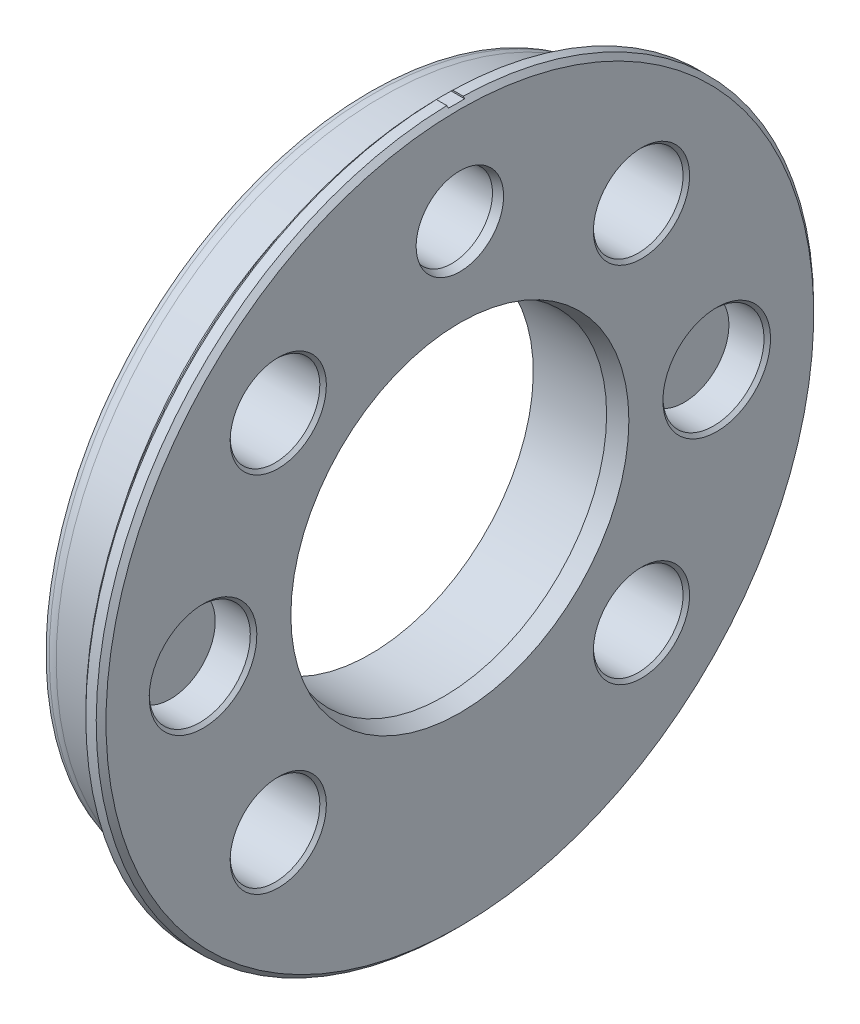
ISO-10303-21;
HEADER;
FILE_DESCRIPTION(('STEP AP214'),'2;1');
FILE_NAME('part.step','',(''),(''),'','','');
FILE_SCHEMA(('AUTOMOTIVE_DESIGN { 1 0 10303 214 1 1 1 1 }'));
ENDSEC;
DATA;
#1=APPLICATION_CONTEXT('core data for automotive mechanical design processes');
#2=APPLICATION_PROTOCOL_DEFINITION('international standard','automotive_design',2000,#1);
#3=PRODUCT_CONTEXT('',#1,'mechanical');
#4=PRODUCT('Part','Part','',(#3));
#5=PRODUCT_RELATED_PRODUCT_CATEGORY('part','',(#4));
#6=PRODUCT_DEFINITION_FORMATION('','',#4);
#7=PRODUCT_DEFINITION_CONTEXT('part definition',#1,'design');
#8=PRODUCT_DEFINITION('design','',#6,#7);
#9=PRODUCT_DEFINITION_SHAPE('','',#8);
#10=(LENGTH_UNIT() NAMED_UNIT(*) SI_UNIT(.MILLI.,.METRE.));
#11=(NAMED_UNIT(*) PLANE_ANGLE_UNIT() SI_UNIT($,.RADIAN.));
#12=(NAMED_UNIT(*) SI_UNIT($,.STERADIAN.) SOLID_ANGLE_UNIT());
#13=UNCERTAINTY_MEASURE_WITH_UNIT(LENGTH_MEASURE(1.E-05),#10,'distance_accuracy_value','');
#14=(GEOMETRIC_REPRESENTATION_CONTEXT(3) GLOBAL_UNCERTAINTY_ASSIGNED_CONTEXT((#13)) GLOBAL_UNIT_ASSIGNED_CONTEXT((#10,
#11,#12)) REPRESENTATION_CONTEXT('',''));
#15=CARTESIAN_POINT('',(0.,0.,0.));
#16=DIRECTION('',(0.,0.,1.));
#17=DIRECTION('',(1.,0.,0.));
#18=AXIS2_PLACEMENT_3D('',#15,#16,#17);
#19=CARTESIAN_POINT('',(436.499877841862,791.1,0.00364851934697978));
#20=DIRECTION('',(-1.,0.,0.));
#21=DIRECTION('',(0.,1.,0.));
#22=AXIS2_PLACEMENT_3D('',#19,#20,#21);
#23=PLANE('',#22);
#24=CARTESIAN_POINT('',(436.499877841862,791.1,0.00364851934695719));
#25=DIRECTION('',(1.,0.,0.));
#26=DIRECTION('',(0.,1.,0.));
#27=AXIS2_PLACEMENT_3D('',#24,#25,#26);
#28=CIRCLE('',#27,10.);
#29=CARTESIAN_POINT('',(436.499877841862,801.1,0.0036485193469578));
#30=VERTEX_POINT('',#29);
#31=EDGE_CURVE('E251',#30,#30,#28,.T.);
#32=ORIENTED_EDGE('',*,*,#31,.T.);
#33=EDGE_LOOP('',(#32));
#34=FACE_BOUND('',#33,.T.);
#35=CARTESIAN_POINT('',(436.499877841862,806.85,0.00364851934695426));
#36=DIRECTION('',(1.,0.,0.));
#37=DIRECTION('',(0.,1.,0.));
#38=AXIS2_PLACEMENT_3D('',#35,#36,#37);
#39=CIRCLE('',#38,2.49999999999994);
#40=CARTESIAN_POINT('',(436.499877841862,809.35,0.00364851934695441));
#41=VERTEX_POINT('',#40);
#42=EDGE_CURVE('E246',#41,#41,#39,.T.);
#43=ORIENTED_EDGE('',*,*,#42,.T.);
#44=EDGE_LOOP('',(#43));
#45=FACE_BOUND('',#44,.T.);
#46=CARTESIAN_POINT('',(436.499877841862,802.236931803686,-11.1332832843411));
#47=DIRECTION('',(1.,0.,0.));
#48=DIRECTION('',(0.,1.,0.));
#49=AXIS2_PLACEMENT_3D('',#46,#47,#48);
#50=CIRCLE('',#49,2.75);
#51=CARTESIAN_POINT('',(436.499877841862,799.486931803686,-11.1332832843411));
#52=VERTEX_POINT('',#51);
#53=EDGE_CURVE('E242',#52,#52,#50,.T.);
#54=ORIENTED_EDGE('',*,*,#53,.T.);
#55=EDGE_LOOP('',(#54));
#56=FACE_BOUND('',#55,.T.);
#57=CARTESIAN_POINT('',(436.499877841862,802.236931803685,11.1405803230352));
#58=DIRECTION('',(1.,0.,0.));
#59=DIRECTION('',(0.,1.,0.));
#60=AXIS2_PLACEMENT_3D('',#57,#58,#59);
#61=CIRCLE('',#60,2.75);
#62=CARTESIAN_POINT('',(436.499877841862,799.486931803685,11.1405803230352));
#63=VERTEX_POINT('',#62);
#64=EDGE_CURVE('E240',#63,#63,#61,.T.);
#65=ORIENTED_EDGE('',*,*,#64,.T.);
#66=EDGE_LOOP('',(#65));
#67=FACE_BOUND('',#66,.T.);
#68=CARTESIAN_POINT('',(436.499877841862,779.963068196309,11.140580323035));
#69=DIRECTION('',(1.,0.,0.));
#70=DIRECTION('',(0.,1.,0.));
#71=AXIS2_PLACEMENT_3D('',#68,#69,#70);
#72=CIRCLE('',#71,2.75);
#73=CARTESIAN_POINT('',(436.499877841862,777.213068196309,11.140580323035));
#74=VERTEX_POINT('',#73);
#75=EDGE_CURVE('E243',#74,#74,#72,.T.);
#76=ORIENTED_EDGE('',*,*,#75,.T.);
#77=EDGE_LOOP('',(#76));
#78=FACE_BOUND('',#77,.T.);
#79=CARTESIAN_POINT('',(436.499877841862,779.96306819631,-11.1332832843413));
#80=DIRECTION('',(1.,0.,0.));
#81=DIRECTION('',(0.,1.,0.));
#82=AXIS2_PLACEMENT_3D('',#79,#80,#81);
#83=CIRCLE('',#82,2.75);
#84=CARTESIAN_POINT('',(436.499877841862,777.213068196309,-11.1332832843413));
#85=VERTEX_POINT('',#84);
#86=EDGE_CURVE('E269',#85,#85,#83,.T.);
#87=ORIENTED_EDGE('',*,*,#86,.T.);
#88=EDGE_LOOP('',(#87));
#89=FACE_BOUND('',#88,.T.);
#90=CARTESIAN_POINT('',(436.499877841862,791.1,0.00364851934695723));
#91=DIRECTION('',(1.,0.,0.));
#92=DIRECTION('',(0.,1.,0.));
#93=AXIS2_PLACEMENT_3D('',#90,#91,#92);
#94=CIRCLE('',#93,19.875);
#95=CARTESIAN_POINT('',(436.499877841862,810.975,0.003648519346956));
#96=VERTEX_POINT('',#95);
#97=EDGE_CURVE('E48',#96,#96,#94,.T.);
#98=ORIENTED_EDGE('',*,*,#97,.F.);
#99=EDGE_LOOP('',(#98));
#100=FACE_BOUND('',#99,.T.);
#101=ADVANCED_FACE('F24',(#34,#45,#56,#67,#78,#89,#100),#23,.T.);
#102=CARTESIAN_POINT('',(439.999877841862,791.1,-15.746351480653));
#103=DIRECTION('',(1.,0.,0.));
#104=DIRECTION('',(0.,0.,1.));
#105=AXIS2_PLACEMENT_3D('',#102,#103,#104);
#106=PLANE('',#105);
#107=CARTESIAN_POINT('',(439.999877841862,791.1,-15.746351480653));
#108=DIRECTION('',(-1.,0.,0.));
#109=DIRECTION('',(0.,0.,-1.));
#110=AXIS2_PLACEMENT_3D('',#107,#108,#109);
#111=CIRCLE('',#110,2.75);
#112=CARTESIAN_POINT('',(439.999877841862,791.1,-18.496351480653));
#113=VERTEX_POINT('',#112);
#114=EDGE_CURVE('E294',#113,#113,#111,.T.);
#115=ORIENTED_EDGE('',*,*,#114,.F.);
#116=EDGE_LOOP('',(#115));
#117=FACE_BOUND('',#116,.T.);
#118=ADVANCED_FACE('F439',(#117),#106,.T.);
#119=CARTESIAN_POINT('',(439.999877841862,791.1,15.753648519347));
#120=DIRECTION('',(1.,0.,0.));
#121=DIRECTION('',(0.,0.,1.));
#122=AXIS2_PLACEMENT_3D('',#119,#120,#121);
#123=PLANE('',#122);
#124=CARTESIAN_POINT('',(439.999877841862,791.1,15.753648519347));
#125=DIRECTION('',(-1.,0.,0.));
#126=DIRECTION('',(0.,0.,-1.));
#127=AXIS2_PLACEMENT_3D('',#124,#125,#126);
#128=CIRCLE('',#127,2.75);
#129=CARTESIAN_POINT('',(439.999877841862,791.1,13.003648519347));
#130=VERTEX_POINT('',#129);
#131=EDGE_CURVE('E266',#130,#130,#128,.T.);
#132=ORIENTED_EDGE('',*,*,#131,.F.);
#133=EDGE_LOOP('',(#132));
#134=FACE_BOUND('',#133,.T.);
#135=ADVANCED_FACE('F445',(#134),#123,.T.);
#136=CARTESIAN_POINT('',(436.999877841862,791.1,-15.7463514806531));
#137=DIRECTION('',(1.,0.,0.));
#138=DIRECTION('',(0.,0.,-1.));
#139=AXIS2_PLACEMENT_3D('',#136,#137,#138);
#140=PLANE('',#139);
#141=CARTESIAN_POINT('',(436.999877841862,791.1,-15.746351480653));
#142=DIRECTION('',(-1.,0.,0.));
#143=DIRECTION('',(0.,0.,-1.));
#144=AXIS2_PLACEMENT_3D('',#141,#142,#143);
#145=CIRCLE('',#144,2.75);
#146=CARTESIAN_POINT('',(436.999877841862,791.1,-18.496351480653));
#147=VERTEX_POINT('',#146);
#148=EDGE_CURVE('E28',#147,#147,#145,.T.);
#149=ORIENTED_EDGE('',*,*,#148,.T.);
#150=EDGE_LOOP('',(#149));
#151=FACE_BOUND('',#150,.T.);
#152=CARTESIAN_POINT('',(436.999877841862,791.1,-15.7463514806531));
#153=DIRECTION('',(1.,0.,0.));
#154=DIRECTION('',(0.,-1.,0.));
#155=AXIS2_PLACEMENT_3D('',#152,#153,#154);
#156=CIRCLE('',#155,3.1);
#157=CARTESIAN_POINT('',(436.999877841862,788.,-15.7463514806531));
#158=VERTEX_POINT('',#157);
#159=EDGE_CURVE('E271',#158,#158,#156,.T.);
#160=ORIENTED_EDGE('',*,*,#159,.T.);
#161=EDGE_LOOP('',(#160));
#162=FACE_BOUND('',#161,.T.);
#163=ADVANCED_FACE('F498',(#151,#162),#140,.T.);
#164=CARTESIAN_POINT('',(436.999877841862,791.1,15.7536485193469));
#165=DIRECTION('',(1.,0.,0.));
#166=DIRECTION('',(0.,0.,-1.));
#167=AXIS2_PLACEMENT_3D('',#164,#165,#166);
#168=PLANE('',#167);
#169=CARTESIAN_POINT('',(436.999877841862,791.1,15.753648519347));
#170=DIRECTION('',(-1.,0.,0.));
#171=DIRECTION('',(0.,0.,-1.));
#172=AXIS2_PLACEMENT_3D('',#169,#170,#171);
#173=CIRCLE('',#172,2.75);
#174=CARTESIAN_POINT('',(436.999877841862,791.1,13.003648519347));
#175=VERTEX_POINT('',#174);
#176=EDGE_CURVE('E189',#175,#175,#173,.T.);
#177=ORIENTED_EDGE('',*,*,#176,.T.);
#178=EDGE_LOOP('',(#177));
#179=FACE_BOUND('',#178,.T.);
#180=CARTESIAN_POINT('',(436.999877841862,791.1,15.7536485193469));
#181=DIRECTION('',(1.,0.,0.));
#182=DIRECTION('',(0.,-1.,0.));
#183=AXIS2_PLACEMENT_3D('',#180,#181,#182);
#184=CIRCLE('',#183,3.1);
#185=CARTESIAN_POINT('',(436.999877841862,788.,15.7536485193469));
#186=VERTEX_POINT('',#185);
#187=EDGE_CURVE('E274',#186,#186,#184,.T.);
#188=ORIENTED_EDGE('',*,*,#187,.T.);
#189=EDGE_LOOP('',(#188));
#190=FACE_BOUND('',#189,.T.);
#191=ADVANCED_FACE('F419',(#179,#190),#168,.T.);
#192=CARTESIAN_POINT('',(433.999877841862,791.1,0.503648519346957));
#193=DIRECTION('',(0.,0.,1.));
#194=DIRECTION('',(-1.,0.,0.));
#195=AXIS2_PLACEMENT_3D('',#192,#193,#194);
#196=PLANE('',#195);
#197=DIRECTION('',(-0.707015048123164,-0.707198502350931,0.));
#198=VECTOR('',#197,1.);
#199=CARTESIAN_POINT('',(441.058885371226,813.09431744792,0.503648519346953));
#200=LINE('',#199,#198);
#201=CARTESIAN_POINT('',(441.058885371226,813.09431744792,0.503648519346961));
#202=VERTEX_POINT('',#201);
#203=CARTESIAN_POINT('',(440.964592390266,813.,0.503648523394978));
#204=VERTEX_POINT('',#203);
#205=EDGE_CURVE('E280',#202,#204,#200,.T.);
#206=ORIENTED_EDGE('',*,*,#205,.F.);
#207=DIRECTION('',(-1.,0.,0.));
#208=VECTOR('',#207,1.);
#209=CARTESIAN_POINT('',(433.999877841862,813.09431744792,0.503648519346965));
#210=LINE('',#209,#208);
#211=CARTESIAN_POINT('',(441.699877841862,813.09431744792,0.503648519346965));
#212=VERTEX_POINT('',#211);
#213=EDGE_CURVE('E13',#212,#202,#210,.T.);
#214=ORIENTED_EDGE('',*,*,#213,.F.);
#215=CARTESIAN_POINT('',(441.794170822913,813.,0.503648519346955));
#216=CARTESIAN_POINT('',(441.76273982923,813.031439114204,0.503651595019211));
#217=CARTESIAN_POINT('',(441.731308835546,813.062878263662,0.503651595021498));
#218=CARTESIAN_POINT('',(441.699877841862,813.09431744792,0.503648519346965));
#219=(BOUNDED_CURVE() B_SPLINE_CURVE(3,(#215,#216,#217,#218),.UNSPECIFIED.,.F.,
.F.) B_SPLINE_CURVE_WITH_KNOTS((4,4),(0.,1.),
.UNSPECIFIED.) CURVE() GEOMETRIC_REPRESENTATION_ITEM() RATIONAL_B_SPLINE_CURVE((1.,1.,1.,1.)) REPRESENTATION_ITEM(''));
#220=CARTESIAN_POINT('',(441.794170822913,813.,0.503648519346955));
#221=VERTEX_POINT('',#220);
#222=EDGE_CURVE('E326',#221,#212,#219,.T.);
#223=ORIENTED_EDGE('',*,*,#222,.F.);
#224=DIRECTION('',(-1.,0.,0.));
#225=VECTOR('',#224,1.);
#226=CARTESIAN_POINT('',(440.058885371226,813.,0.503648519346953));
#227=LINE('',#226,#225);
#228=EDGE_CURVE('E256',#221,#204,#227,.T.);
#229=ORIENTED_EDGE('',*,*,#228,.T.);
#230=EDGE_LOOP('',(#206,#214,#223,#229));
#231=FACE_BOUND('',#230,.T.);
#232=ADVANCED_FACE('F505',(#231),#196,.F.);
#233=CARTESIAN_POINT('',(433.999877841862,791.1,0.00364851934695719));
#234=DIRECTION('',(-1.,0.,0.));
#235=DIRECTION('',(0.,1.,0.));
#236=AXIS2_PLACEMENT_3D('',#233,#234,#235);
#237=CYLINDRICAL_SURFACE('',#236,22.);
#238=DIRECTION('',(-1.,0.,0.));
#239=VECTOR('',#238,1.);
#240=CARTESIAN_POINT('',(433.999877841862,813.09431744792,-0.496351480653047));
#241=LINE('',#240,#239);
#242=CARTESIAN_POINT('',(441.699877841862,813.09431744792,-0.496351480653048));
#243=VERTEX_POINT('',#242);
#244=CARTESIAN_POINT('',(441.058885371226,813.09431744792,-0.496351480653046));
#245=VERTEX_POINT('',#244);
#246=EDGE_CURVE('E35',#243,#245,#241,.T.);
#247=ORIENTED_EDGE('',*,*,#246,.F.);
#248=CARTESIAN_POINT('',(441.699877841862,791.1,0.00364851934695723));
#249=DIRECTION('',(1.,0.,0.));
#250=DIRECTION('',(0.,1.,0.));
#251=AXIS2_PLACEMENT_3D('',#248,#249,#250);
#252=CIRCLE('',#251,22.);
#253=EDGE_CURVE('E350',#212,#243,#252,.T.);
#254=ORIENTED_EDGE('',*,*,#253,.F.);
#255=ORIENTED_EDGE('',*,*,#213,.T.);
#256=CARTESIAN_POINT('',(441.058885371226,791.1,0.00364851934695719));
#257=DIRECTION('',(1.,0.,0.));
#258=DIRECTION('',(0.,1.,0.));
#259=AXIS2_PLACEMENT_3D('',#256,#257,#258);
#260=CIRCLE('',#259,22.);
#261=EDGE_CURVE('E276',#202,#245,#260,.T.);
#262=ORIENTED_EDGE('',*,*,#261,.T.);
#263=EDGE_LOOP('',(#247,#254,#255,#262));
#264=FACE_BOUND('',#263,.T.);
#265=ADVANCED_FACE('F396',(#264),#237,.T.);
#266=CARTESIAN_POINT('',(433.999877841862,791.1,-0.496351480653043));
#267=DIRECTION('',(0.,0.,1.));
#268=DIRECTION('',(-1.,0.,0.));
#269=AXIS2_PLACEMENT_3D('',#266,#267,#268);
#270=PLANE('',#269);
#271=ORIENTED_EDGE('',*,*,#246,.T.);
#272=CARTESIAN_POINT('',(440.964592390174,813.,-0.496351480653047));
#273=CARTESIAN_POINT('',(440.996023383858,813.031439114204,-0.4963545563253));
#274=CARTESIAN_POINT('',(441.027454377541,813.062878263662,-0.496354556327583));
#275=CARTESIAN_POINT('',(441.058885371226,813.09431744792,-0.496351480653046));
#276=(BOUNDED_CURVE() B_SPLINE_CURVE(3,(#272,#273,#274,#275),.UNSPECIFIED.,.F.,
.F.) B_SPLINE_CURVE_WITH_KNOTS((4,4),(0.,1.),
.UNSPECIFIED.) CURVE() GEOMETRIC_REPRESENTATION_ITEM() RATIONAL_B_SPLINE_CURVE((1.,1.,1.,1.)) REPRESENTATION_ITEM(''));
#277=CARTESIAN_POINT('',(440.964592390174,813.,-0.496351480653047));
#278=VERTEX_POINT('',#277);
#279=EDGE_CURVE('E267',#278,#245,#276,.T.);
#280=ORIENTED_EDGE('',*,*,#279,.F.);
#281=DIRECTION('',(1.,0.,0.));
#282=VECTOR('',#281,1.);
#283=CARTESIAN_POINT('',(440.058885371226,813.,-0.496351480653047));
#284=LINE('',#283,#282);
#285=CARTESIAN_POINT('',(441.794170557885,813.000000265094,-0.496351480678981));
#286=VERTEX_POINT('',#285);
#287=EDGE_CURVE('E177',#278,#286,#284,.T.);
#288=ORIENTED_EDGE('',*,*,#287,.T.);
#289=CARTESIAN_POINT('',(441.699877841862,813.09431744792,-0.496351480653048));
#290=CARTESIAN_POINT('',(441.731308747203,813.062878352027,-0.496354556318939));
#291=CARTESIAN_POINT('',(441.762739652545,813.031439290935,-0.4963545563253));
#292=CARTESIAN_POINT('',(441.794170557885,813.000000265094,-0.496351480678981));
#293=(BOUNDED_CURVE() B_SPLINE_CURVE(3,(#289,#290,#291,#292),.UNSPECIFIED.,.F.,
.F.) B_SPLINE_CURVE_WITH_KNOTS((4,4),(0.,0.99999906310439),
.UNSPECIFIED.) CURVE() GEOMETRIC_REPRESENTATION_ITEM() RATIONAL_B_SPLINE_CURVE((1.,1.,1.,1.)) REPRESENTATION_ITEM(''));
#294=EDGE_CURVE('E344',#243,#286,#293,.T.);
#295=ORIENTED_EDGE('',*,*,#294,.F.);
#296=EDGE_LOOP('',(#271,#280,#288,#295));
#297=FACE_BOUND('',#296,.T.);
#298=ADVANCED_FACE('F400',(#297),#270,.T.);
#299=CARTESIAN_POINT('',(440.058885371226,813.,-0.496351480653047));
#300=DIRECTION('',(0.,-1.,0.));
#301=DIRECTION('',(0.,0.,1.));
#302=AXIS2_PLACEMENT_3D('',#299,#300,#301);
#303=PLANE('',#302);
#304=CARTESIAN_POINT('',(440.958885371226,813.,0.00364851934695589));
#305=CARTESIAN_POINT('',(440.958885371226,813.,-0.163025376815659));
#306=CARTESIAN_POINT('',(440.960787710875,813.,-0.329663100609856));
#307=CARTESIAN_POINT('',(440.964592390174,813.,-0.496351480653047));
#308=(BOUNDED_CURVE() B_SPLINE_CURVE(3,(#304,#305,#306,#307),.UNSPECIFIED.,.F.,
.F.) B_SPLINE_CURVE_WITH_KNOTS((4,4),(0.,1.),
.UNSPECIFIED.) CURVE() GEOMETRIC_REPRESENTATION_ITEM() RATIONAL_B_SPLINE_CURVE((1.,1.,1.,1.)) REPRESENTATION_ITEM(''));
#309=CARTESIAN_POINT('',(440.958885371226,813.,0.00364851934695589));
#310=VERTEX_POINT('',#309);
#311=EDGE_CURVE('E379',#310,#278,#308,.T.);
#312=ORIENTED_EDGE('',*,*,#311,.F.);
#313=CARTESIAN_POINT('',(440.964592390266,813.,0.503648523394978));
#314=CARTESIAN_POINT('',(440.960787710936,813.000000000059,0.336960142000939));
#315=CARTESIAN_POINT('',(440.958885371226,813.,0.170322415509467));
#316=CARTESIAN_POINT('',(440.958885371226,813.,0.00364851934695589));
#317=(BOUNDED_CURVE() B_SPLINE_CURVE(3,(#313,#314,#315,#316),.UNSPECIFIED.,.F.,
.F.) B_SPLINE_CURVE_WITH_KNOTS((4,4),(0.,1.),
.UNSPECIFIED.) CURVE() GEOMETRIC_REPRESENTATION_ITEM() RATIONAL_B_SPLINE_CURVE((1.,1.,1.,1.)) REPRESENTATION_ITEM(''));
#318=EDGE_CURVE('E319',#204,#310,#317,.T.);
#319=ORIENTED_EDGE('',*,*,#318,.F.);
#320=ORIENTED_EDGE('',*,*,#228,.F.);
#321=CARTESIAN_POINT('',(441.799877841862,813.,0.00364851934696125));
#322=CARTESIAN_POINT('',(441.799877841862,813.,0.170322415509611));
#323=CARTESIAN_POINT('',(441.797975502212,813.,0.336960139303805));
#324=CARTESIAN_POINT('',(441.794170822913,813.,0.503648519346955));
#325=(BOUNDED_CURVE() B_SPLINE_CURVE(3,(#321,#322,#323,#324),.UNSPECIFIED.,.F.,
.F.) B_SPLINE_CURVE_WITH_KNOTS((4,4),(0.,1.),
.UNSPECIFIED.) CURVE() GEOMETRIC_REPRESENTATION_ITEM() RATIONAL_B_SPLINE_CURVE((1.,1.,1.,1.)) REPRESENTATION_ITEM(''));
#326=CARTESIAN_POINT('',(441.799877841862,813.,0.00364851934696125));
#327=VERTEX_POINT('',#326);
#328=EDGE_CURVE('E320',#327,#221,#325,.T.);
#329=ORIENTED_EDGE('',*,*,#328,.F.);
#330=CARTESIAN_POINT('',(441.794170557885,813.000000265094,-0.496351480678981));
#331=CARTESIAN_POINT('',(441.797975443255,813.,-0.32966568447429));
#332=CARTESIAN_POINT('',(441.799877841862,813.,-0.163027959320533));
#333=CARTESIAN_POINT('',(441.799877841862,813.,0.00364851934696125));
#334=(BOUNDED_CURVE() B_SPLINE_CURVE(3,(#330,#331,#332,#333),.UNSPECIFIED.,.F.,
.F.) B_SPLINE_CURVE_WITH_KNOTS((4,4),(0.,1.),
.UNSPECIFIED.) CURVE() GEOMETRIC_REPRESENTATION_ITEM() RATIONAL_B_SPLINE_CURVE((1.,1.,1.,1.)) REPRESENTATION_ITEM(''));
#335=EDGE_CURVE('E327',#286,#327,#334,.T.);
#336=ORIENTED_EDGE('',*,*,#335,.F.);
#337=ORIENTED_EDGE('',*,*,#287,.F.);
#338=EDGE_LOOP('',(#312,#319,#320,#329,#336,#337));
#339=FACE_BOUND('',#338,.T.);
#340=ADVANCED_FACE('F455',(#339),#303,.F.);
#341=CARTESIAN_POINT('',(441.999877841862,801.1,0.00364851934695533));
#342=DIRECTION('',(-1.,0.,0.));
#343=DIRECTION('',(0.,1.,0.));
#344=AXIS2_PLACEMENT_3D('',#341,#342,#343);
#345=PLANE('',#344);
#346=CARTESIAN_POINT('',(441.999877841862,791.1,0.00364851934695723));
#347=DIRECTION('',(1.,0.,0.));
#348=DIRECTION('',(0.,-1.,0.));
#349=AXIS2_PLACEMENT_3D('',#346,#347,#348);
#350=CIRCLE('',#349,10.3639702342662);
#351=CARTESIAN_POINT('',(441.999877841862,780.736029765731,0.0036485193469566));
#352=VERTEX_POINT('',#351);
#353=EDGE_CURVE('E343',#352,#352,#350,.T.);
#354=ORIENTED_EDGE('',*,*,#353,.F.);
#355=EDGE_LOOP('',(#354));
#356=FACE_BOUND('',#355,.T.);
#357=CARTESIAN_POINT('',(441.999877841926,806.85,0.00364851934695429));
#358=DIRECTION('',(1.,0.,0.));
#359=DIRECTION('',(0.,-1.,0.));
#360=AXIS2_PLACEMENT_3D('',#357,#358,#359);
#361=CIRCLE('',#360,2.68198511713836);
#362=CARTESIAN_POINT('',(441.999877841926,804.168014882859,0.00364851934695412));
#363=VERTEX_POINT('',#362);
#364=EDGE_CURVE('E360',#363,#363,#361,.T.);
#365=ORIENTED_EDGE('',*,*,#364,.F.);
#366=EDGE_LOOP('',(#365));
#367=FACE_BOUND('',#366,.T.);
#368=CARTESIAN_POINT('',(441.999877841901,802.236931803686,-11.1332832843411));
#369=DIRECTION('',(1.,0.,0.));
#370=DIRECTION('',(0.,-1.,0.));
#371=AXIS2_PLACEMENT_3D('',#368,#369,#370);
#372=CIRCLE('',#371,2.94999999999846);
#373=CARTESIAN_POINT('',(441.999877841901,799.286931803687,-11.1332832843411));
#374=VERTEX_POINT('',#373);
#375=EDGE_CURVE('E224',#374,#374,#372,.T.);
#376=ORIENTED_EDGE('',*,*,#375,.F.);
#377=EDGE_LOOP('',(#376));
#378=FACE_BOUND('',#377,.T.);
#379=CARTESIAN_POINT('',(441.999877841787,802.236931803685,11.1405803230352));
#380=DIRECTION('',(1.,0.,0.));
#381=DIRECTION('',(0.,-1.,0.));
#382=AXIS2_PLACEMENT_3D('',#379,#380,#381);
#383=CIRCLE('',#382,2.94999999999846);
#384=CARTESIAN_POINT('',(441.999877841787,799.286931803687,11.1405803230352));
#385=VERTEX_POINT('',#384);
#386=EDGE_CURVE('E225',#385,#385,#383,.T.);
#387=ORIENTED_EDGE('',*,*,#386,.F.);
#388=EDGE_LOOP('',(#387));
#389=FACE_BOUND('',#388,.T.);
#390=CARTESIAN_POINT('',(441.999877841952,779.963068196309,11.140580323035));
#391=DIRECTION('',(1.,0.,0.));
#392=DIRECTION('',(0.,-1.,0.));
#393=AXIS2_PLACEMENT_3D('',#390,#391,#392);
#394=CIRCLE('',#393,2.95000000011214);
#395=CARTESIAN_POINT('',(441.999877841952,777.013068196197,11.140580323035));
#396=VERTEX_POINT('',#395);
#397=EDGE_CURVE('E247',#396,#396,#394,.T.);
#398=ORIENTED_EDGE('',*,*,#397,.F.);
#399=EDGE_LOOP('',(#398));
#400=FACE_BOUND('',#399,.T.);
#401=CARTESIAN_POINT('',(441.999877841782,779.96306819631,-11.1332832843413));
#402=DIRECTION('',(1.,0.,0.));
#403=DIRECTION('',(0.,-1.,0.));
#404=AXIS2_PLACEMENT_3D('',#401,#402,#403);
#405=CIRCLE('',#404,2.94999999999846);
#406=CARTESIAN_POINT('',(441.999877841782,777.013068196311,-11.1332832843413));
#407=VERTEX_POINT('',#406);
#408=EDGE_CURVE('E305',#407,#407,#405,.T.);
#409=ORIENTED_EDGE('',*,*,#408,.F.);
#410=EDGE_LOOP('',(#409));
#411=FACE_BOUND('',#410,.T.);
#412=CARTESIAN_POINT('',(441.999877841813,791.1,-15.7463514806531));
#413=DIRECTION('',(1.,0.,0.));
#414=DIRECTION('',(0.,-1.,0.));
#415=AXIS2_PLACEMENT_3D('',#412,#413,#414);
#416=CIRCLE('',#415,3.29999999991059);
#417=CARTESIAN_POINT('',(441.999877841813,787.800000000087,-15.7463514806531));
#418=VERTEX_POINT('',#417);
#419=EDGE_CURVE('E300',#418,#418,#416,.T.);
#420=ORIENTED_EDGE('',*,*,#419,.F.);
#421=EDGE_LOOP('',(#420));
#422=FACE_BOUND('',#421,.T.);
#423=CARTESIAN_POINT('',(441.999877841756,791.1,15.7536485193469));
#424=DIRECTION('',(1.,0.,0.));
#425=DIRECTION('',(0.,-1.,0.));
#426=AXIS2_PLACEMENT_3D('',#423,#424,#425);
#427=CIRCLE('',#426,3.29999999991059);
#428=CARTESIAN_POINT('',(441.999877841756,787.800000000087,15.7536485193469));
#429=VERTEX_POINT('',#428);
#430=EDGE_CURVE('E301',#429,#429,#427,.T.);
#431=ORIENTED_EDGE('',*,*,#430,.F.);
#432=EDGE_LOOP('',(#431));
#433=FACE_BOUND('',#432,.T.);
#434=CARTESIAN_POINT('',(441.999877841862,791.1,0.00364851934695723));
#435=DIRECTION('',(-1.,0.,0.));
#436=DIRECTION('',(0.,1.,0.));
#437=AXIS2_PLACEMENT_3D('',#434,#435,#436);
#438=CIRCLE('',#437,21.7);
#439=CARTESIAN_POINT('',(441.999877841862,769.4,0.00364851934695323));
#440=VERTEX_POINT('',#439);
#441=EDGE_CURVE('E336',#440,#440,#438,.T.);
#442=ORIENTED_EDGE('',*,*,#441,.F.);
#443=EDGE_LOOP('',(#442));
#444=FACE_BOUND('',#443,.T.);
#445=ADVANCED_FACE('F461',(#356,#367,#378,#389,#400,#411,#422,#433,#444),#345,.F.);
#446=CARTESIAN_POINT('',(436.761017843024,791.1,0.00364851934695723));
#447=DIRECTION('',(1.,0.,0.));
#448=DIRECTION('',(0.,-1.,0.));
#449=AXIS2_PLACEMENT_3D('',#446,#447,#448);
#450=CONICAL_SURFACE('',#449,19.9402850002906,0.244978663126864);
#451=CARTESIAN_POINT('',(436.761017843024,791.1,0.00364851934695723));
#452=DIRECTION('',(-1.,0.,0.));
#453=DIRECTION('',(0.,-1.,0.));
#454=AXIS2_PLACEMENT_3D('',#451,#452,#453);
#455=CIRCLE('',#454,19.9402850002906);
#456=CARTESIAN_POINT('',(436.761017843024,771.159714999707,0.00364851934695601));
#457=VERTEX_POINT('',#456);
#458=EDGE_CURVE('E287',#457,#457,#455,.T.);
#459=ORIENTED_EDGE('',*,*,#458,.T.);
#460=EDGE_LOOP('',(#459));
#461=FACE_BOUND('',#460,.T.);
#462=ORIENTED_EDGE('',*,*,#97,.T.);
#463=EDGE_LOOP('',(#462));
#464=FACE_BOUND('',#463,.T.);
#465=ADVANCED_FACE('F26',(#461,#464),#450,.T.);
#466=CARTESIAN_POINT('',(433.999877841862,791.1,0.00364851934695719));
#467=DIRECTION('',(-1.,0.,0.));
#468=DIRECTION('',(0.,1.,0.));
#469=AXIS2_PLACEMENT_3D('',#466,#467,#468);
#470=CYLINDRICAL_SURFACE('',#469,10.);
#471=ORIENTED_EDGE('',*,*,#31,.F.);
#472=EDGE_LOOP('',(#471));
#473=FACE_BOUND('',#472,.T.);
#474=CARTESIAN_POINT('',(440.999877841862,791.1,0.00364851934695723));
#475=DIRECTION('',(1.,0.,0.));
#476=DIRECTION('',(0.,-1.,0.));
#477=AXIS2_PLACEMENT_3D('',#474,#475,#476);
#478=CIRCLE('',#477,10.);
#479=CARTESIAN_POINT('',(440.999877841862,781.1,0.00364851934695535));
#480=VERTEX_POINT('',#479);
#481=EDGE_CURVE('E337',#480,#480,#478,.T.);
#482=ORIENTED_EDGE('',*,*,#481,.T.);
#483=EDGE_LOOP('',(#482));
#484=FACE_BOUND('',#483,.T.);
#485=ADVANCED_FACE('F456',(#473,#484),#470,.F.);
#486=CARTESIAN_POINT('',(431.711307163006,806.85,0.00364851934695426));
#487=DIRECTION('',(-1.,0.,0.));
#488=DIRECTION('',(0.,1.,0.));
#489=AXIS2_PLACEMENT_3D('',#486,#487,#488);
#490=CYLINDRICAL_SURFACE('',#489,2.49999999999994);
#491=ORIENTED_EDGE('',*,*,#42,.F.);
#492=EDGE_LOOP('',(#491));
#493=FACE_BOUND('',#492,.T.);
#494=CARTESIAN_POINT('',(441.499877841825,806.85,0.00364851934695559));
#495=DIRECTION('',(1.,0.,0.));
#496=DIRECTION('',(0.,-1.,0.));
#497=AXIS2_PLACEMENT_3D('',#494,#495,#496);
#498=CIRCLE('',#497,2.50000000000073);
#499=CARTESIAN_POINT('',(441.499877841825,804.35,0.00364851934695379));
#500=VERTEX_POINT('',#499);
#501=EDGE_CURVE('E232',#500,#500,#498,.T.);
#502=ORIENTED_EDGE('',*,*,#501,.T.);
#503=EDGE_LOOP('',(#502));
#504=FACE_BOUND('',#503,.T.);
#505=ADVANCED_FACE('F459',(#493,#504),#490,.F.);
#506=CARTESIAN_POINT('',(441.999877841862,802.236931803686,-11.1332832843411));
#507=DIRECTION('',(1.,0.,0.));
#508=DIRECTION('',(0.,-1.,0.));
#509=AXIS2_PLACEMENT_3D('',#506,#507,#508);
#510=CYLINDRICAL_SURFACE('',#509,2.75);
#511=CARTESIAN_POINT('',(441.79987784192,802.236931803686,-11.1332832843411));
#512=DIRECTION('',(1.,0.,0.));
#513=DIRECTION('',(0.,-1.,0.));
#514=AXIS2_PLACEMENT_3D('',#511,#512,#513);
#515=CIRCLE('',#514,2.74999999996095);
#516=CARTESIAN_POINT('',(441.79987784192,799.486931803725,-11.1332832843411));
#517=VERTEX_POINT('',#516);
#518=EDGE_CURVE('E219',#517,#517,#515,.T.);
#519=ORIENTED_EDGE('',*,*,#518,.T.);
#520=EDGE_LOOP('',(#519));
#521=FACE_BOUND('',#520,.T.);
#522=ORIENTED_EDGE('',*,*,#53,.F.);
#523=EDGE_LOOP('',(#522));
#524=FACE_BOUND('',#523,.T.);
#525=ADVANCED_FACE('F220',(#521,#524),#510,.F.);
#526=CARTESIAN_POINT('',(441.999877841862,802.236931803685,11.1405803230352));
#527=DIRECTION('',(1.,0.,0.));
#528=DIRECTION('',(0.,-1.,0.));
#529=AXIS2_PLACEMENT_3D('',#526,#527,#528);
#530=CYLINDRICAL_SURFACE('',#529,2.75);
#531=CARTESIAN_POINT('',(441.799877841863,802.236931803685,11.1405803230352));
#532=DIRECTION('',(1.,0.,0.));
#533=DIRECTION('',(0.,-1.,0.));
#534=AXIS2_PLACEMENT_3D('',#531,#532,#533);
#535=CIRCLE('',#534,2.75000000007441);
#536=CARTESIAN_POINT('',(441.799877841863,799.486931803611,11.1405803230352));
#537=VERTEX_POINT('',#536);
#538=EDGE_CURVE('E235',#537,#537,#535,.T.);
#539=ORIENTED_EDGE('',*,*,#538,.T.);
#540=EDGE_LOOP('',(#539));
#541=FACE_BOUND('',#540,.T.);
#542=ORIENTED_EDGE('',*,*,#64,.F.);
#543=EDGE_LOOP('',(#542));
#544=FACE_BOUND('',#543,.T.);
#545=ADVANCED_FACE('F451',(#541,#544),#530,.F.);
#546=CARTESIAN_POINT('',(441.999877841862,779.963068196309,11.140580323035));
#547=DIRECTION('',(1.,0.,0.));
#548=DIRECTION('',(0.,-1.,0.));
#549=AXIS2_PLACEMENT_3D('',#546,#547,#548);
#550=CYLINDRICAL_SURFACE('',#549,2.75);
#551=CARTESIAN_POINT('',(441.799877841863,779.963068196309,11.140580323035));
#552=DIRECTION('',(1.,0.,0.));
#553=DIRECTION('',(0.,-1.,0.));
#554=AXIS2_PLACEMENT_3D('',#551,#552,#553);
#555=CIRCLE('',#554,2.75000000002279);
#556=CARTESIAN_POINT('',(441.799877841863,777.213068196287,11.140580323035));
#557=VERTEX_POINT('',#556);
#558=EDGE_CURVE('E250',#557,#557,#555,.T.);
#559=ORIENTED_EDGE('',*,*,#558,.T.);
#560=EDGE_LOOP('',(#559));
#561=FACE_BOUND('',#560,.T.);
#562=ORIENTED_EDGE('',*,*,#75,.F.);
#563=EDGE_LOOP('',(#562));
#564=FACE_BOUND('',#563,.T.);
#565=ADVANCED_FACE('F491',(#561,#564),#550,.F.);
#566=CARTESIAN_POINT('',(441.999877841862,779.96306819631,-11.1332832843413));
#567=DIRECTION('',(1.,0.,0.));
#568=DIRECTION('',(0.,-1.,0.));
#569=AXIS2_PLACEMENT_3D('',#566,#567,#568);
#570=CYLINDRICAL_SURFACE('',#569,2.75);
#571=CARTESIAN_POINT('',(441.799877841807,779.96306819631,-11.1332832843413));
#572=DIRECTION('',(1.,0.,0.));
#573=DIRECTION('',(0.,-1.,0.));
#574=AXIS2_PLACEMENT_3D('',#571,#572,#573);
#575=CIRCLE('',#574,2.75000000002301);
#576=CARTESIAN_POINT('',(441.799877841807,777.213068196287,-11.1332832843413));
#577=VERTEX_POINT('',#576);
#578=EDGE_CURVE('E309',#577,#577,#575,.T.);
#579=ORIENTED_EDGE('',*,*,#578,.T.);
#580=EDGE_LOOP('',(#579));
#581=FACE_BOUND('',#580,.T.);
#582=ORIENTED_EDGE('',*,*,#86,.F.);
#583=EDGE_LOOP('',(#582));
#584=FACE_BOUND('',#583,.T.);
#585=ADVANCED_FACE('F488',(#581,#584),#570,.F.);
#586=CARTESIAN_POINT('',(439.500806681313,791.1,0.00364851934695723));
#587=DIRECTION('',(-1.,0.,0.));
#588=DIRECTION('',(0.,1.,0.));
#589=AXIS2_PLACEMENT_3D('',#586,#587,#588);
#590=CONICAL_SURFACE('',#589,20.,0.261799387799139);
#591=CARTESIAN_POINT('',(439.500806681313,791.1,0.00364851934695719));
#592=DIRECTION('',(-1.,0.,0.));
#593=DIRECTION('',(0.,1.,0.));
#594=AXIS2_PLACEMENT_3D('',#591,#592,#593);
#595=CIRCLE('',#594,20.);
#596=CARTESIAN_POINT('',(439.500806681313,771.1,0.00364851934695356));
#597=VERTEX_POINT('',#596);
#598=EDGE_CURVE('E286',#597,#597,#595,.T.);
#599=ORIENTED_EDGE('',*,*,#598,.F.);
#600=EDGE_LOOP('',(#599));
#601=FACE_BOUND('',#600,.T.);
#602=CARTESIAN_POINT('',(440.196350223821,791.1,0.00364851934695549));
#603=DIRECTION('',(-1.,0.,0.));
#604=DIRECTION('',(0.,0.,1.));
#605=AXIS2_PLACEMENT_3D('',#602,#603,#604);
#606=CIRCLE('',#605,19.8136296694843);
#607=CARTESIAN_POINT('',(440.196350223821,771.286370330513,0.00364851934695346));
#608=VERTEX_POINT('',#607);
#609=EDGE_CURVE('E263',#608,#608,#606,.T.);
#610=ORIENTED_EDGE('',*,*,#609,.T.);
#611=EDGE_LOOP('',(#610));
#612=FACE_BOUND('',#611,.T.);
#613=ADVANCED_FACE('F474',(#601,#612),#590,.T.);
#614=CARTESIAN_POINT('',(433.999877841862,791.1,0.00364851934695719));
#615=DIRECTION('',(-1.,0.,0.));
#616=DIRECTION('',(0.,1.,0.));
#617=AXIS2_PLACEMENT_3D('',#614,#615,#616);
#618=CYLINDRICAL_SURFACE('',#617,20.);
#619=CARTESIAN_POINT('',(437.246089093097,791.1,0.00364851934695723));
#620=DIRECTION('',(-1.,0.,0.));
#621=DIRECTION('',(0.,0.,1.));
#622=AXIS2_PLACEMENT_3D('',#619,#620,#621);
#623=CIRCLE('',#622,20.);
#624=CARTESIAN_POINT('',(437.246089093097,771.1,0.00364851934695351));
#625=VERTEX_POINT('',#624);
#626=EDGE_CURVE('E283',#625,#625,#623,.T.);
#627=ORIENTED_EDGE('',*,*,#626,.F.);
#628=EDGE_LOOP('',(#627));
#629=FACE_BOUND('',#628,.T.);
#630=ORIENTED_EDGE('',*,*,#598,.T.);
#631=EDGE_LOOP('',(#630));
#632=FACE_BOUND('',#631,.T.);
#633=ADVANCED_FACE('F470',(#629,#632),#618,.T.);
#634=CARTESIAN_POINT('',(437.246089093097,791.1,0.00364851934695549));
#635=DIRECTION('',(1.,0.,0.));
#636=DIRECTION('',(0.,-1.,0.));
#637=AXIS2_PLACEMENT_3D('',#634,#635,#636);
#638=TOROIDAL_SURFACE('',#637,18.0000000000003,1.99999999999968);
#639=ORIENTED_EDGE('',*,*,#626,.T.);
#640=EDGE_LOOP('',(#639));
#641=FACE_BOUND('',#640,.T.);
#642=ORIENTED_EDGE('',*,*,#458,.F.);
#643=EDGE_LOOP('',(#642));
#644=FACE_BOUND('',#643,.T.);
#645=ADVANCED_FACE('F473',(#641,#644),#638,.T.);
#646=CARTESIAN_POINT('',(440.839710011966,791.1,0.00364851934695723));
#647=DIRECTION('',(1.,0.,0.));
#648=DIRECTION('',(0.,-1.,0.));
#649=AXIS2_PLACEMENT_3D('',#646,#647,#648);
#650=CONICAL_SURFACE('',#649,21.7808246407406,1.48352986419519);
#651=CARTESIAN_POINT('',(440.839710011966,791.1,0.00364851934695723));
#652=DIRECTION('',(1.,0.,0.));
#653=DIRECTION('',(0.,-1.,0.));
#654=AXIS2_PLACEMENT_3D('',#651,#652,#653);
#655=CIRCLE('',#654,21.7808246407406);
#656=CARTESIAN_POINT('',(440.839710011966,812.880824640738,0.0036485193469559));
#657=VERTEX_POINT('',#656);
#658=EDGE_CURVE('E273',#657,#657,#655,.T.);
#659=ORIENTED_EDGE('',*,*,#658,.F.);
#660=EDGE_LOOP('',(#659));
#661=FACE_BOUND('',#660,.T.);
#662=CARTESIAN_POINT('',(440.698355721098,791.1,0.00364851934695723));
#663=DIRECTION('',(1.,0.,0.));
#664=DIRECTION('',(0.,-1.,0.));
#665=AXIS2_PLACEMENT_3D('',#662,#663,#664);
#666=CIRCLE('',#665,20.1651377029009);
#667=CARTESIAN_POINT('',(440.698355721098,811.265137702899,0.0036485193469602));
#668=VERTEX_POINT('',#667);
#669=EDGE_CURVE('E259',#668,#668,#666,.T.);
#670=ORIENTED_EDGE('',*,*,#669,.T.);
#671=EDGE_LOOP('',(#670));
#672=FACE_BOUND('',#671,.T.);
#673=ADVANCED_FACE('F486',(#661,#672),#650,.T.);
#674=CARTESIAN_POINT('',(471.749877841862,791.1,-15.746351480653));
#675=DIRECTION('',(1.,0.,0.));
#676=DIRECTION('',(0.,0.,-1.));
#677=AXIS2_PLACEMENT_3D('',#674,#675,#676);
#678=CYLINDRICAL_SURFACE('',#677,2.75);
#679=ORIENTED_EDGE('',*,*,#114,.T.);
#680=EDGE_LOOP('',(#679));
#681=FACE_BOUND('',#680,.T.);
#682=ORIENTED_EDGE('',*,*,#148,.F.);
#683=EDGE_LOOP('',(#682));
#684=FACE_BOUND('',#683,.T.);
#685=ADVANCED_FACE('F482',(#681,#684),#678,.T.);
#686=CARTESIAN_POINT('',(471.749877841862,791.1,15.753648519347));
#687=DIRECTION('',(1.,0.,0.));
#688=DIRECTION('',(0.,0.,-1.));
#689=AXIS2_PLACEMENT_3D('',#686,#687,#688);
#690=CYLINDRICAL_SURFACE('',#689,2.75);
#691=ORIENTED_EDGE('',*,*,#131,.T.);
#692=EDGE_LOOP('',(#691));
#693=FACE_BOUND('',#692,.T.);
#694=ORIENTED_EDGE('',*,*,#176,.F.);
#695=EDGE_LOOP('',(#694));
#696=FACE_BOUND('',#695,.T.);
#697=ADVANCED_FACE('F485',(#693,#696),#690,.T.);
#698=CARTESIAN_POINT('',(441.058885371226,791.1,0.00364851934695723));
#699=DIRECTION('',(1.,0.,0.));
#700=DIRECTION('',(0.,-1.,0.));
#701=AXIS2_PLACEMENT_3D('',#698,#699,#700);
#702=CONICAL_SURFACE('',#701,22.,0.785398163397487);
#703=ORIENTED_EDGE('',*,*,#261,.F.);
#704=ORIENTED_EDGE('',*,*,#205,.T.);
#705=ORIENTED_EDGE('',*,*,#318,.T.);
#706=ORIENTED_EDGE('',*,*,#311,.T.);
#707=ORIENTED_EDGE('',*,*,#279,.T.);
#708=EDGE_LOOP('',(#703,#704,#705,#706,#707));
#709=FACE_BOUND('',#708,.T.);
#710=ORIENTED_EDGE('',*,*,#658,.T.);
#711=EDGE_LOOP('',(#710));
#712=FACE_BOUND('',#711,.T.);
#713=ADVANCED_FACE('F434',(#709,#712),#702,.T.);
#714=CARTESIAN_POINT('',(436.999877841862,791.1,-15.7463514806531));
#715=DIRECTION('',(1.,0.,0.));
#716=DIRECTION('',(0.,-1.,0.));
#717=AXIS2_PLACEMENT_3D('',#714,#715,#716);
#718=CYLINDRICAL_SURFACE('',#717,3.1);
#719=CARTESIAN_POINT('',(441.799877841807,791.1,-15.7463514806531));
#720=DIRECTION('',(1.,0.,0.));
#721=DIRECTION('',(0.,-1.,0.));
#722=AXIS2_PLACEMENT_3D('',#719,#720,#721);
#723=CIRCLE('',#722,3.0999999999608);
#724=CARTESIAN_POINT('',(441.799877841807,788.000000000037,-15.7463514806531));
#725=VERTEX_POINT('',#724);
#726=EDGE_CURVE('E297',#725,#725,#723,.T.);
#727=ORIENTED_EDGE('',*,*,#726,.T.);
#728=EDGE_LOOP('',(#727));
#729=FACE_BOUND('',#728,.T.);
#730=ORIENTED_EDGE('',*,*,#159,.F.);
#731=EDGE_LOOP('',(#730));
#732=FACE_BOUND('',#731,.T.);
#733=ADVANCED_FACE('F424',(#729,#732),#718,.F.);
#734=CARTESIAN_POINT('',(436.999877841862,791.1,15.7536485193469));
#735=DIRECTION('',(1.,0.,0.));
#736=DIRECTION('',(0.,-1.,0.));
#737=AXIS2_PLACEMENT_3D('',#734,#735,#736);
#738=CYLINDRICAL_SURFACE('',#737,3.1);
#739=CARTESIAN_POINT('',(441.799877841863,791.1,15.7536485193469));
#740=DIRECTION('',(1.,0.,0.));
#741=DIRECTION('',(0.,-1.,0.));
#742=AXIS2_PLACEMENT_3D('',#739,#740,#741);
#743=CIRCLE('',#742,3.10000000007449);
#744=CARTESIAN_POINT('',(441.799877841863,787.999999999923,15.7536485193469));
#745=VERTEX_POINT('',#744);
#746=EDGE_CURVE('E262',#745,#745,#743,.T.);
#747=ORIENTED_EDGE('',*,*,#746,.T.);
#748=EDGE_LOOP('',(#747));
#749=FACE_BOUND('',#748,.T.);
#750=ORIENTED_EDGE('',*,*,#187,.F.);
#751=EDGE_LOOP('',(#750));
#752=FACE_BOUND('',#751,.T.);
#753=ADVANCED_FACE('F421',(#749,#752),#738,.F.);
#754=CARTESIAN_POINT('',(441.999877841862,791.1,0.00364851934695723));
#755=DIRECTION('',(1.,0.,0.));
#756=DIRECTION('',(0.,-1.,0.));
#757=AXIS2_PLACEMENT_3D('',#754,#755,#756);
#758=CONICAL_SURFACE('',#757,10.3639702342662,0.349065850398874);
#759=ORIENTED_EDGE('',*,*,#353,.T.);
#760=EDGE_LOOP('',(#759));
#761=FACE_BOUND('',#760,.T.);
#762=ORIENTED_EDGE('',*,*,#481,.F.);
#763=EDGE_LOOP('',(#762));
#764=FACE_BOUND('',#763,.T.);
#765=ADVANCED_FACE('F423',(#761,#764),#758,.F.);
#766=CARTESIAN_POINT('',(441.699877841862,791.1,0.00364851934695723));
#767=DIRECTION('',(-1.,0.,0.));
#768=DIRECTION('',(0.,1.,0.));
#769=AXIS2_PLACEMENT_3D('',#766,#767,#768);
#770=CONICAL_SURFACE('',#769,22.,0.78539816339746);
#771=ORIENTED_EDGE('',*,*,#335,.T.);
#772=ORIENTED_EDGE('',*,*,#328,.T.);
#773=ORIENTED_EDGE('',*,*,#222,.T.);
#774=ORIENTED_EDGE('',*,*,#253,.T.);
#775=ORIENTED_EDGE('',*,*,#294,.T.);
#776=EDGE_LOOP('',(#771,#772,#773,#774,#775));
#777=FACE_BOUND('',#776,.T.);
#778=ORIENTED_EDGE('',*,*,#441,.T.);
#779=EDGE_LOOP('',(#778));
#780=FACE_BOUND('',#779,.T.);
#781=ADVANCED_FACE('F391',(#777,#780),#770,.T.);
#782=CARTESIAN_POINT('',(441.999877841926,806.85,0.00364851934695429));
#783=DIRECTION('',(1.,0.,0.));
#784=DIRECTION('',(0.,-1.,0.));
#785=AXIS2_PLACEMENT_3D('',#782,#783,#784);
#786=CONICAL_SURFACE('',#785,2.68198511713836,0.349065850355056);
#787=ORIENTED_EDGE('',*,*,#364,.T.);
#788=EDGE_LOOP('',(#787));
#789=FACE_BOUND('',#788,.T.);
#790=ORIENTED_EDGE('',*,*,#501,.F.);
#791=EDGE_LOOP('',(#790));
#792=FACE_BOUND('',#791,.T.);
#793=ADVANCED_FACE('F465',(#789,#792),#786,.F.);
#794=CARTESIAN_POINT('',(441.999877841926,802.236931803686,-11.1332832843411));
#795=DIRECTION('',(1.,0.,0.));
#796=DIRECTION('',(0.,-1.,0.));
#797=AXIS2_PLACEMENT_3D('',#794,#795,#796);
#798=CONICAL_SURFACE('',#797,2.95000000002443,0.785398163539596);
#799=ORIENTED_EDGE('',*,*,#375,.T.);
#800=EDGE_LOOP('',(#799));
#801=FACE_BOUND('',#800,.T.);
#802=ORIENTED_EDGE('',*,*,#518,.F.);
#803=EDGE_LOOP('',(#802));
#804=FACE_BOUND('',#803,.T.);
#805=ADVANCED_FACE('F468',(#801,#804),#798,.F.);
#806=CARTESIAN_POINT('',(441.999877841756,802.236931803685,11.1405803230352));
#807=DIRECTION('',(1.,0.,0.));
#808=DIRECTION('',(0.,-1.,0.));
#809=AXIS2_PLACEMENT_3D('',#806,#807,#808);
#810=CONICAL_SURFACE('',#809,2.94999999996737,0.785398163397452);
#811=ORIENTED_EDGE('',*,*,#386,.T.);
#812=EDGE_LOOP('',(#811));
#813=FACE_BOUND('',#812,.T.);
#814=ORIENTED_EDGE('',*,*,#538,.F.);
#815=EDGE_LOOP('',(#814));
#816=FACE_BOUND('',#815,.T.);
#817=ADVANCED_FACE('F508',(#813,#816),#810,.F.);
#818=CARTESIAN_POINT('',(441.999877841926,779.963068196309,11.140580323035));
#819=DIRECTION('',(1.,0.,0.));
#820=DIRECTION('',(0.,-1.,0.));
#821=AXIS2_PLACEMENT_3D('',#818,#819,#820);
#822=CONICAL_SURFACE('',#821,2.95000000008628,0.785398163397452);
#823=ORIENTED_EDGE('',*,*,#397,.T.);
#824=EDGE_LOOP('',(#823));
#825=FACE_BOUND('',#824,.T.);
#826=ORIENTED_EDGE('',*,*,#558,.F.);
#827=EDGE_LOOP('',(#826));
#828=FACE_BOUND('',#827,.T.);
#829=ADVANCED_FACE('F513',(#825,#828),#822,.F.);
#830=CARTESIAN_POINT('',(441.999877841699,779.96306819631,-11.1332832843413));
#831=DIRECTION('',(1.,0.,0.));
#832=DIRECTION('',(0.,-1.,0.));
#833=AXIS2_PLACEMENT_3D('',#830,#831,#832);
#834=CONICAL_SURFACE('',#833,2.94999999991597,0.785398163397448);
#835=ORIENTED_EDGE('',*,*,#408,.T.);
#836=EDGE_LOOP('',(#835));
#837=FACE_BOUND('',#836,.T.);
#838=ORIENTED_EDGE('',*,*,#578,.F.);
#839=EDGE_LOOP('',(#838));
#840=FACE_BOUND('',#839,.T.);
#841=ADVANCED_FACE('F480',(#837,#840),#834,.F.);
#842=CARTESIAN_POINT('',(441.99987784187,791.1,-15.7463514806531));
#843=DIRECTION('',(1.,0.,0.));
#844=DIRECTION('',(0.,-1.,0.));
#845=AXIS2_PLACEMENT_3D('',#842,#843,#844);
#846=CONICAL_SURFACE('',#845,3.29999999996744,0.785398163255378);
#847=ORIENTED_EDGE('',*,*,#419,.T.);
#848=EDGE_LOOP('',(#847));
#849=FACE_BOUND('',#848,.T.);
#850=ORIENTED_EDGE('',*,*,#726,.F.);
#851=EDGE_LOOP('',(#850));
#852=FACE_BOUND('',#851,.T.);
#853=ADVANCED_FACE('F476',(#849,#852),#846,.F.);
#854=CARTESIAN_POINT('',(441.999877841756,791.1,15.7536485193469));
#855=DIRECTION('',(1.,0.,0.));
#856=DIRECTION('',(0.,-1.,0.));
#857=AXIS2_PLACEMENT_3D('',#854,#855,#856);
#858=CONICAL_SURFACE('',#857,3.29999999991059,0.785398163397452);
#859=ORIENTED_EDGE('',*,*,#430,.T.);
#860=EDGE_LOOP('',(#859));
#861=FACE_BOUND('',#860,.T.);
#862=ORIENTED_EDGE('',*,*,#746,.F.);
#863=EDGE_LOOP('',(#862));
#864=FACE_BOUND('',#863,.T.);
#865=ADVANCED_FACE('F479',(#861,#864),#858,.F.);
#866=CARTESIAN_POINT('',(440.299877841862,791.1,0.00364851934695897));
#867=DIRECTION('',(-1.,0.,0.));
#868=DIRECTION('',(0.,1.,0.));
#869=AXIS2_PLACEMENT_3D('',#866,#867,#868);
#870=TOROIDAL_SURFACE('',#869,20.2,0.399999999999993);
#871=ORIENTED_EDGE('',*,*,#669,.F.);
#872=EDGE_LOOP('',(#871));
#873=FACE_BOUND('',#872,.T.);
#874=ORIENTED_EDGE('',*,*,#609,.F.);
#875=EDGE_LOOP('',(#874));
#876=FACE_BOUND('',#875,.T.);
#877=ADVANCED_FACE('F725',(#873,#876),#870,.F.);
#878=CLOSED_SHELL('',(#101,#118,#135,#163,#191,#232,#265,#298,#340,#445,#465,#485,#505,#525,
#545,#565,#585,#613,#633,#645,#673,#685,#697,#713,#733,#753,#765,#781,#793,#805,#817,#829,#841,
#853,#865,#877));
#879=MANIFOLD_SOLID_BREP('B1',#878);
#880=ADVANCED_BREP_SHAPE_REPRESENTATION('',(#18,#879),#14);
#881=SHAPE_DEFINITION_REPRESENTATION(#9,#880);
ENDSEC;
END-ISO-10303-21;
